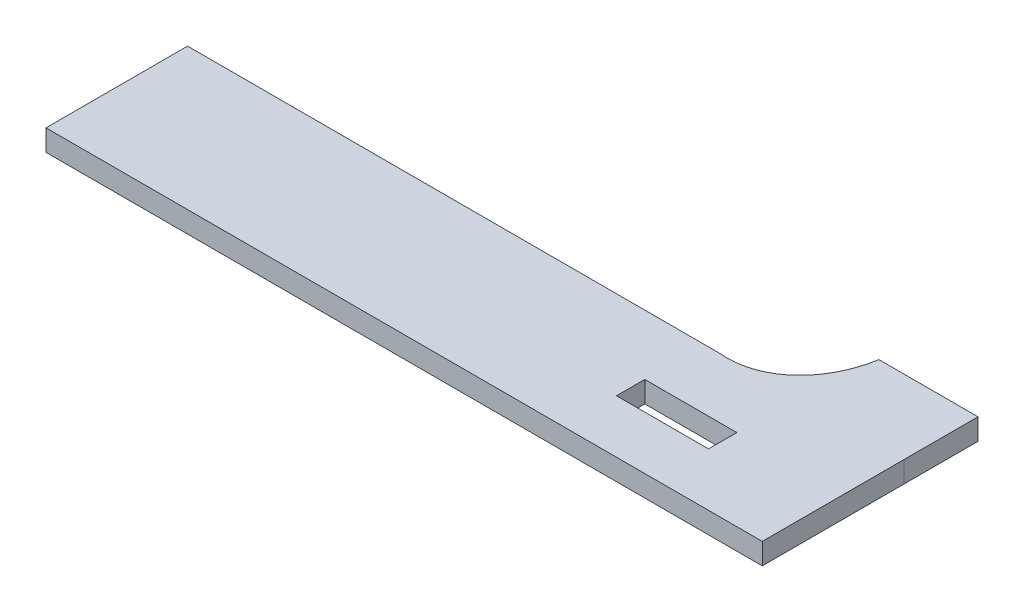
ISO-10303-21;
HEADER;
FILE_DESCRIPTION(('STEP AP214'),'2;1');
FILE_NAME('part.step','',(''),(''),'','','');
FILE_SCHEMA(('AUTOMOTIVE_DESIGN { 1 0 10303 214 1 1 1 1 }'));
ENDSEC;
DATA;
#1=APPLICATION_CONTEXT('core data for automotive mechanical design processes');
#2=APPLICATION_PROTOCOL_DEFINITION('international standard','automotive_design',2000,#1);
#3=PRODUCT_CONTEXT('',#1,'mechanical');
#4=PRODUCT('Part','Part','',(#3));
#5=PRODUCT_RELATED_PRODUCT_CATEGORY('part','',(#4));
#6=PRODUCT_DEFINITION_FORMATION('','',#4);
#7=PRODUCT_DEFINITION_CONTEXT('part definition',#1,'design');
#8=PRODUCT_DEFINITION('design','',#6,#7);
#9=PRODUCT_DEFINITION_SHAPE('','',#8);
#10=(LENGTH_UNIT() NAMED_UNIT(*) SI_UNIT(.MILLI.,.METRE.));
#11=(NAMED_UNIT(*) PLANE_ANGLE_UNIT() SI_UNIT($,.RADIAN.));
#12=(NAMED_UNIT(*) SI_UNIT($,.STERADIAN.) SOLID_ANGLE_UNIT());
#13=UNCERTAINTY_MEASURE_WITH_UNIT(LENGTH_MEASURE(1.E-05),#10,'distance_accuracy_value','');
#14=(GEOMETRIC_REPRESENTATION_CONTEXT(3) GLOBAL_UNCERTAINTY_ASSIGNED_CONTEXT((#13)) GLOBAL_UNIT_ASSIGNED_CONTEXT((#10,
#11,#12)) REPRESENTATION_CONTEXT('',''));
#15=CARTESIAN_POINT('',(0.,0.,0.));
#16=DIRECTION('',(0.,0.,1.));
#17=DIRECTION('',(1.,0.,0.));
#18=AXIS2_PLACEMENT_3D('',#15,#16,#17);
#19=CARTESIAN_POINT('',(17.7324804360068,3.,-10.3817710380302));
#20=CARTESIAN_POINT('',(24.7769965206093,3.,-9.69292673499625));
#21=CARTESIAN_POINT('',(29.0309133016131,3.,-15.202698523246));
#22=CARTESIAN_POINT('',(29.9211927748743,3.,-20.8623706429771));
#23=B_SPLINE_CURVE_WITH_KNOTS('',3,(#19,#20,#21,#22),.UNSPECIFIED.,.F.,.F.,(4,4),(0.,1.),.UNSPECIFIED.);
#24=DIRECTION('',(0.,-1.,0.));
#25=VECTOR('',#24,1.);
#26=SURFACE_OF_LINEAR_EXTRUSION('',#23,#25);
#27=CARTESIAN_POINT('',(17.7324804360068,0.,-10.3817710380302));
#28=CARTESIAN_POINT('',(24.7769965206093,0.,-9.69292673499625));
#29=CARTESIAN_POINT('',(29.0309133016131,0.,-15.202698523246));
#30=CARTESIAN_POINT('',(29.9211927748743,0.,-20.8623706429771));
#31=B_SPLINE_CURVE_WITH_KNOTS('',3,(#27,#28,#29,#30),.UNSPECIFIED.,.F.,.F.,(4,4),(0.,1.),.UNSPECIFIED.);
#32=CARTESIAN_POINT('',(17.7324804360068,0.,-10.3817710380302));
#33=VERTEX_POINT('',#32);
#34=CARTESIAN_POINT('',(29.9211927748743,0.,-20.8623706429771));
#35=VERTEX_POINT('',#34);
#36=EDGE_CURVE('E153',#33,#35,#31,.T.);
#37=ORIENTED_EDGE('',*,*,#36,.F.);
#38=DIRECTION('',(0.,-1.,0.));
#39=VECTOR('',#38,1.);
#40=CARTESIAN_POINT('',(17.7324804360068,3.,-10.3817710380302));
#41=LINE('',#40,#39);
#42=CARTESIAN_POINT('',(17.7324804360068,3.,-10.3817710380302));
#43=VERTEX_POINT('',#42);
#44=EDGE_CURVE('E11',#43,#33,#41,.T.);
#45=ORIENTED_EDGE('',*,*,#44,.F.);
#46=CARTESIAN_POINT('',(29.9211927748743,3.,-20.8623706429771));
#47=VERTEX_POINT('',#46);
#48=EDGE_CURVE('E156',#43,#47,#23,.T.);
#49=ORIENTED_EDGE('',*,*,#48,.T.);
#50=DIRECTION('',(0.,-1.,0.));
#51=VECTOR('',#50,1.);
#52=CARTESIAN_POINT('',(29.9211927748743,3.,-20.8623706429771));
#53=LINE('',#52,#51);
#54=EDGE_CURVE('E182',#47,#35,#53,.T.);
#55=ORIENTED_EDGE('',*,*,#54,.T.);
#56=EDGE_LOOP('',(#37,#45,#49,#55));
#57=FACE_BOUND('',#56,.T.);
#58=ADVANCED_FACE('F38',(#57),#26,.T.);
#59=CARTESIAN_POINT('',(0.,3.,-10.3817710380302));
#60=DIRECTION('',(0.,0.,-1.));
#61=DIRECTION('',(-1.,0.,0.));
#62=AXIS2_PLACEMENT_3D('',#59,#60,#61);
#63=PLANE('',#62);
#64=DIRECTION('',(1.,0.,0.));
#65=VECTOR('',#64,1.);
#66=CARTESIAN_POINT('',(0.,0.,-10.3817710380302));
#67=LINE('',#66,#65);
#68=CARTESIAN_POINT('',(-57.2675195639932,0.,-10.3817710380302));
#69=VERTEX_POINT('',#68);
#70=EDGE_CURVE('E187',#69,#33,#67,.T.);
#71=ORIENTED_EDGE('',*,*,#70,.F.);
#72=DIRECTION('',(0.,-1.,0.));
#73=VECTOR('',#72,1.);
#74=CARTESIAN_POINT('',(-57.2675195639932,3.,-10.3817710380302));
#75=LINE('',#74,#73);
#76=CARTESIAN_POINT('',(-57.2675195639932,3.,-10.3817710380302));
#77=VERTEX_POINT('',#76);
#78=EDGE_CURVE('E46',#77,#69,#75,.T.);
#79=ORIENTED_EDGE('',*,*,#78,.F.);
#80=DIRECTION('',(1.,0.,0.));
#81=VECTOR('',#80,1.);
#82=CARTESIAN_POINT('',(0.,3.,-10.3817710380302));
#83=LINE('',#82,#81);
#84=EDGE_CURVE('E162',#77,#43,#83,.T.);
#85=ORIENTED_EDGE('',*,*,#84,.T.);
#86=ORIENTED_EDGE('',*,*,#44,.T.);
#87=EDGE_LOOP('',(#71,#79,#85,#86));
#88=FACE_BOUND('',#87,.T.);
#89=ADVANCED_FACE('F224',(#88),#63,.T.);
#90=CARTESIAN_POINT('',(-57.2675195639932,3.,0.));
#91=DIRECTION('',(1.,0.,0.));
#92=DIRECTION('',(0.,0.,-1.));
#93=AXIS2_PLACEMENT_3D('',#90,#91,#92);
#94=PLANE('',#93);
#95=DIRECTION('',(0.,0.,1.));
#96=VECTOR('',#95,1.);
#97=CARTESIAN_POINT('',(-57.2675195639932,0.,0.));
#98=LINE('',#97,#96);
#99=CARTESIAN_POINT('',(-57.2675195639932,0.,9.61822896196981));
#100=VERTEX_POINT('',#99);
#101=EDGE_CURVE('E193',#69,#100,#98,.T.);
#102=ORIENTED_EDGE('',*,*,#101,.T.);
#103=DIRECTION('',(0.,-1.,0.));
#104=VECTOR('',#103,1.);
#105=CARTESIAN_POINT('',(-57.2675195639932,3.,9.61822896196981));
#106=LINE('',#105,#104);
#107=CARTESIAN_POINT('',(-57.2675195639932,3.,9.61822896196981));
#108=VERTEX_POINT('',#107);
#109=EDGE_CURVE('E213',#108,#100,#106,.T.);
#110=ORIENTED_EDGE('',*,*,#109,.F.);
#111=DIRECTION('',(0.,0.,1.));
#112=VECTOR('',#111,1.);
#113=CARTESIAN_POINT('',(-57.2675195639932,3.,0.));
#114=LINE('',#113,#112);
#115=EDGE_CURVE('E169',#77,#108,#114,.T.);
#116=ORIENTED_EDGE('',*,*,#115,.F.);
#117=ORIENTED_EDGE('',*,*,#78,.T.);
#118=EDGE_LOOP('',(#102,#110,#116,#117));
#119=FACE_BOUND('',#118,.T.);
#120=ADVANCED_FACE('F218',(#119),#94,.F.);
#121=CARTESIAN_POINT('',(0.,3.,9.61822896196981));
#122=DIRECTION('',(0.,0.,-1.));
#123=DIRECTION('',(-1.,0.,0.));
#124=AXIS2_PLACEMENT_3D('',#121,#122,#123);
#125=PLANE('',#124);
#126=DIRECTION('',(1.,0.,0.));
#127=VECTOR('',#126,1.);
#128=CARTESIAN_POINT('',(0.,0.,9.61822896196981));
#129=LINE('',#128,#127);
#130=CARTESIAN_POINT('',(43.9224804360068,0.,9.61822896196981));
#131=VERTEX_POINT('',#130);
#132=EDGE_CURVE('E195',#100,#131,#129,.T.);
#133=ORIENTED_EDGE('',*,*,#132,.T.);
#134=DIRECTION('',(0.,-1.,0.));
#135=VECTOR('',#134,1.);
#136=CARTESIAN_POINT('',(43.9224804360068,3.,9.61822896196981));
#137=LINE('',#136,#135);
#138=CARTESIAN_POINT('',(43.9224804360068,3.,9.61822896196981));
#139=VERTEX_POINT('',#138);
#140=EDGE_CURVE('E211',#139,#131,#137,.T.);
#141=ORIENTED_EDGE('',*,*,#140,.F.);
#142=DIRECTION('',(1.,0.,0.));
#143=VECTOR('',#142,1.);
#144=CARTESIAN_POINT('',(0.,3.,9.61822896196981));
#145=LINE('',#144,#143);
#146=EDGE_CURVE('E171',#108,#139,#145,.T.);
#147=ORIENTED_EDGE('',*,*,#146,.F.);
#148=ORIENTED_EDGE('',*,*,#109,.T.);
#149=EDGE_LOOP('',(#133,#141,#147,#148));
#150=FACE_BOUND('',#149,.T.);
#151=ADVANCED_FACE('F243',(#150),#125,.F.);
#152=CARTESIAN_POINT('',(43.9224804360068,3.,0.));
#153=DIRECTION('',(1.,0.,0.));
#154=DIRECTION('',(0.,0.,-1.));
#155=AXIS2_PLACEMENT_3D('',#152,#153,#154);
#156=PLANE('',#155);
#157=DIRECTION('',(0.,0.,1.));
#158=VECTOR('',#157,1.);
#159=CARTESIAN_POINT('',(43.9224804360068,0.,0.));
#160=LINE('',#159,#158);
#161=CARTESIAN_POINT('',(43.9224804360068,0.,-10.3817710380302));
#162=VERTEX_POINT('',#161);
#163=EDGE_CURVE('E198',#162,#131,#160,.T.);
#164=ORIENTED_EDGE('',*,*,#163,.F.);
#165=DIRECTION('',(0.,-1.,0.));
#166=VECTOR('',#165,1.);
#167=CARTESIAN_POINT('',(43.9224804360068,3.,-10.3817710380302));
#168=LINE('',#167,#166);
#169=CARTESIAN_POINT('',(43.9224804360068,3.,-10.3817710380302));
#170=VERTEX_POINT('',#169);
#171=EDGE_CURVE('E209',#170,#162,#168,.T.);
#172=ORIENTED_EDGE('',*,*,#171,.F.);
#173=DIRECTION('',(0.,0.,1.));
#174=VECTOR('',#173,1.);
#175=CARTESIAN_POINT('',(43.9224804360068,3.,0.));
#176=LINE('',#175,#174);
#177=EDGE_CURVE('E173',#170,#139,#176,.T.);
#178=ORIENTED_EDGE('',*,*,#177,.T.);
#179=ORIENTED_EDGE('',*,*,#140,.T.);
#180=EDGE_LOOP('',(#164,#172,#178,#179));
#181=FACE_BOUND('',#180,.T.);
#182=ADVANCED_FACE('F238',(#181),#156,.T.);
#183=CARTESIAN_POINT('',(43.9237552918976,3.,-0.00539653403582726));
#184=DIRECTION('',(0.999999992452538,0.,-0.00012286139833068));
#185=DIRECTION('',(-0.00012286139833068,0.,-0.999999992452538));
#186=AXIS2_PLACEMENT_3D('',#183,#184,#185);
#187=PLANE('',#186);
#188=DIRECTION('',(0.00012286139833068,0.,0.999999992452538));
#189=VECTOR('',#188,1.);
#190=CARTESIAN_POINT('',(43.9237552918976,0.,-0.00539653403582726));
#191=LINE('',#190,#189);
#192=CARTESIAN_POINT('',(43.9211927748743,0.,-20.8623706429771));
#193=VERTEX_POINT('',#192);
#194=EDGE_CURVE('E201',#193,#162,#191,.T.);
#195=ORIENTED_EDGE('',*,*,#194,.F.);
#196=DIRECTION('',(0.,-1.,0.));
#197=VECTOR('',#196,1.);
#198=CARTESIAN_POINT('',(43.9211927748743,3.,-20.8623706429771));
#199=LINE('',#198,#197);
#200=CARTESIAN_POINT('',(43.9211927748743,3.,-20.8623706429771));
#201=VERTEX_POINT('',#200);
#202=EDGE_CURVE('E207',#201,#193,#199,.T.);
#203=ORIENTED_EDGE('',*,*,#202,.F.);
#204=DIRECTION('',(0.00012286139833068,0.,0.999999992452538));
#205=VECTOR('',#204,1.);
#206=CARTESIAN_POINT('',(43.9237552918976,3.,-0.00539653403582726));
#207=LINE('',#206,#205);
#208=EDGE_CURVE('E176',#201,#170,#207,.T.);
#209=ORIENTED_EDGE('',*,*,#208,.T.);
#210=ORIENTED_EDGE('',*,*,#171,.T.);
#211=EDGE_LOOP('',(#195,#203,#209,#210));
#212=FACE_BOUND('',#211,.T.);
#213=ADVANCED_FACE('F235',(#212),#187,.T.);
#214=CARTESIAN_POINT('',(0.,3.,-20.8623706429771));
#215=DIRECTION('',(0.,0.,-1.));
#216=DIRECTION('',(-1.,0.,0.));
#217=AXIS2_PLACEMENT_3D('',#214,#215,#216);
#218=PLANE('',#217);
#219=DIRECTION('',(1.,0.,0.));
#220=VECTOR('',#219,1.);
#221=CARTESIAN_POINT('',(0.,0.,-20.8623706429771));
#222=LINE('',#221,#220);
#223=EDGE_CURVE('E163',#35,#193,#222,.T.);
#224=ORIENTED_EDGE('',*,*,#223,.F.);
#225=ORIENTED_EDGE('',*,*,#54,.F.);
#226=DIRECTION('',(1.,0.,0.));
#227=VECTOR('',#226,1.);
#228=CARTESIAN_POINT('',(0.,3.,-20.8623706429771));
#229=LINE('',#228,#227);
#230=EDGE_CURVE('E179',#47,#201,#229,.T.);
#231=ORIENTED_EDGE('',*,*,#230,.T.);
#232=ORIENTED_EDGE('',*,*,#202,.T.);
#233=EDGE_LOOP('',(#224,#225,#231,#232));
#234=FACE_BOUND('',#233,.T.);
#235=ADVANCED_FACE('F230',(#234),#218,.T.);
#236=CARTESIAN_POINT('',(0.,3.,0.));
#237=DIRECTION('',(0.,1.,0.));
#238=DIRECTION('',(0.,0.,1.));
#239=AXIS2_PLACEMENT_3D('',#236,#237,#238);
#240=PLANE('',#239);
#241=DIRECTION('',(0.,0.,1.));
#242=VECTOR('',#241,1.);
#243=CARTESIAN_POINT('',(15.8126019458903,3.,-1.89903766646022));
#244=LINE('',#243,#242);
#245=CARTESIAN_POINT('',(15.8126019458903,3.,-1.89903766646022));
#246=VERTEX_POINT('',#245);
#247=CARTESIAN_POINT('',(15.8126019458903,3.,2.10096233353978));
#248=VERTEX_POINT('',#247);
#249=EDGE_CURVE('E53',#246,#248,#244,.T.);
#250=ORIENTED_EDGE('',*,*,#249,.F.);
#251=DIRECTION('',(-1.,0.,0.));
#252=VECTOR('',#251,1.);
#253=CARTESIAN_POINT('',(15.8126019458903,3.,-1.89903766646022));
#254=LINE('',#253,#252);
#255=CARTESIAN_POINT('',(28.8126019458903,3.,-1.89903766646022));
#256=VERTEX_POINT('',#255);
#257=EDGE_CURVE('E138',#256,#246,#254,.T.);
#258=ORIENTED_EDGE('',*,*,#257,.F.);
#259=DIRECTION('',(0.,0.,-1.));
#260=VECTOR('',#259,1.);
#261=CARTESIAN_POINT('',(28.8126019458903,3.,-1.89903766646022));
#262=LINE('',#261,#260);
#263=CARTESIAN_POINT('',(28.8126019458903,3.,2.10096233353978));
#264=VERTEX_POINT('',#263);
#265=EDGE_CURVE('E141',#264,#256,#262,.T.);
#266=ORIENTED_EDGE('',*,*,#265,.F.);
#267=DIRECTION('',(1.,0.,0.));
#268=VECTOR('',#267,1.);
#269=CARTESIAN_POINT('',(15.8126019458903,3.,2.10096233353978));
#270=LINE('',#269,#268);
#271=EDGE_CURVE('E147',#248,#264,#270,.T.);
#272=ORIENTED_EDGE('',*,*,#271,.F.);
#273=EDGE_LOOP('',(#250,#258,#266,#272));
#274=FACE_BOUND('',#273,.T.);
#275=ORIENTED_EDGE('',*,*,#48,.F.);
#276=ORIENTED_EDGE('',*,*,#84,.F.);
#277=ORIENTED_EDGE('',*,*,#115,.T.);
#278=ORIENTED_EDGE('',*,*,#146,.T.);
#279=ORIENTED_EDGE('',*,*,#177,.F.);
#280=ORIENTED_EDGE('',*,*,#208,.F.);
#281=ORIENTED_EDGE('',*,*,#230,.F.);
#282=EDGE_LOOP('',(#275,#276,#277,#278,#279,#280,#281));
#283=FACE_BOUND('',#282,.T.);
#284=ADVANCED_FACE('F245',(#274,#283),#240,.T.);
#285=CARTESIAN_POINT('',(0.,0.,0.));
#286=DIRECTION('',(0.,1.,0.));
#287=DIRECTION('',(0.,0.,1.));
#288=AXIS2_PLACEMENT_3D('',#285,#286,#287);
#289=PLANE('',#288);
#290=DIRECTION('',(-1.,0.,0.));
#291=VECTOR('',#290,1.);
#292=CARTESIAN_POINT('',(15.8126019458903,0.,-1.89903766646022));
#293=LINE('',#292,#291);
#294=CARTESIAN_POINT('',(28.8126019458903,0.,-1.89903766646022));
#295=VERTEX_POINT('',#294);
#296=CARTESIAN_POINT('',(15.8126019458903,0.,-1.89903766646022));
#297=VERTEX_POINT('',#296);
#298=EDGE_CURVE('E128',#295,#297,#293,.T.);
#299=ORIENTED_EDGE('',*,*,#298,.T.);
#300=DIRECTION('',(0.,0.,1.));
#301=VECTOR('',#300,1.);
#302=CARTESIAN_POINT('',(15.8126019458903,0.,-1.89903766646022));
#303=LINE('',#302,#301);
#304=CARTESIAN_POINT('',(15.8126019458903,0.,2.10096233353978));
#305=VERTEX_POINT('',#304);
#306=EDGE_CURVE('E122',#297,#305,#303,.T.);
#307=ORIENTED_EDGE('',*,*,#306,.T.);
#308=DIRECTION('',(1.,0.,0.));
#309=VECTOR('',#308,1.);
#310=CARTESIAN_POINT('',(15.8126019458903,0.,2.10096233353978));
#311=LINE('',#310,#309);
#312=CARTESIAN_POINT('',(28.8126019458903,0.,2.10096233353978));
#313=VERTEX_POINT('',#312);
#314=EDGE_CURVE('E131',#305,#313,#311,.T.);
#315=ORIENTED_EDGE('',*,*,#314,.T.);
#316=DIRECTION('',(0.,0.,-1.));
#317=VECTOR('',#316,1.);
#318=CARTESIAN_POINT('',(28.8126019458903,0.,-1.89903766646022));
#319=LINE('',#318,#317);
#320=EDGE_CURVE('E61',#313,#295,#319,.T.);
#321=ORIENTED_EDGE('',*,*,#320,.T.);
#322=EDGE_LOOP('',(#299,#307,#315,#321));
#323=FACE_BOUND('',#322,.T.);
#324=ORIENTED_EDGE('',*,*,#36,.T.);
#325=ORIENTED_EDGE('',*,*,#223,.T.);
#326=ORIENTED_EDGE('',*,*,#194,.T.);
#327=ORIENTED_EDGE('',*,*,#163,.T.);
#328=ORIENTED_EDGE('',*,*,#132,.F.);
#329=ORIENTED_EDGE('',*,*,#101,.F.);
#330=ORIENTED_EDGE('',*,*,#70,.T.);
#331=EDGE_LOOP('',(#324,#325,#326,#327,#328,#329,#330));
#332=FACE_BOUND('',#331,.T.);
#333=ADVANCED_FACE('F135',(#323,#332),#289,.F.);
#334=CARTESIAN_POINT('',(15.8126019458903,0.,-1.89903766646022));
#335=DIRECTION('',(-1.,0.,0.));
#336=DIRECTION('',(0.,0.,1.));
#337=AXIS2_PLACEMENT_3D('',#334,#335,#336);
#338=PLANE('',#337);
#339=ORIENTED_EDGE('',*,*,#249,.T.);
#340=DIRECTION('',(0.,1.,0.));
#341=VECTOR('',#340,1.);
#342=CARTESIAN_POINT('',(15.8126019458903,0.,2.10096233353978));
#343=LINE('',#342,#341);
#344=EDGE_CURVE('E118',#305,#248,#343,.T.);
#345=ORIENTED_EDGE('',*,*,#344,.F.);
#346=ORIENTED_EDGE('',*,*,#306,.F.);
#347=DIRECTION('',(0.,1.,0.));
#348=VECTOR('',#347,1.);
#349=CARTESIAN_POINT('',(15.8126019458903,0.,-1.89903766646022));
#350=LINE('',#349,#348);
#351=EDGE_CURVE('E151',#297,#246,#350,.T.);
#352=ORIENTED_EDGE('',*,*,#351,.T.);
#353=EDGE_LOOP('',(#339,#345,#346,#352));
#354=FACE_BOUND('',#353,.T.);
#355=ADVANCED_FACE('F120',(#354),#338,.F.);
#356=CARTESIAN_POINT('',(15.8126019458903,0.,-1.89903766646022));
#357=DIRECTION('',(0.,0.,-1.));
#358=DIRECTION('',(-1.,0.,0.));
#359=AXIS2_PLACEMENT_3D('',#356,#357,#358);
#360=PLANE('',#359);
#361=ORIENTED_EDGE('',*,*,#257,.T.);
#362=ORIENTED_EDGE('',*,*,#351,.F.);
#363=ORIENTED_EDGE('',*,*,#298,.F.);
#364=DIRECTION('',(0.,1.,0.));
#365=VECTOR('',#364,1.);
#366=CARTESIAN_POINT('',(28.8126019458903,0.,-1.89903766646022));
#367=LINE('',#366,#365);
#368=EDGE_CURVE('E154',#295,#256,#367,.T.);
#369=ORIENTED_EDGE('',*,*,#368,.T.);
#370=EDGE_LOOP('',(#361,#362,#363,#369));
#371=FACE_BOUND('',#370,.T.);
#372=ADVANCED_FACE('F300',(#371),#360,.F.);
#373=CARTESIAN_POINT('',(28.8126019458903,0.,-1.89903766646022));
#374=DIRECTION('',(1.,0.,0.));
#375=DIRECTION('',(0.,0.,-1.));
#376=AXIS2_PLACEMENT_3D('',#373,#374,#375);
#377=PLANE('',#376);
#378=ORIENTED_EDGE('',*,*,#265,.T.);
#379=ORIENTED_EDGE('',*,*,#368,.F.);
#380=ORIENTED_EDGE('',*,*,#320,.F.);
#381=DIRECTION('',(0.,1.,0.));
#382=VECTOR('',#381,1.);
#383=CARTESIAN_POINT('',(28.8126019458903,0.,2.10096233353978));
#384=LINE('',#383,#382);
#385=EDGE_CURVE('E127',#313,#264,#384,.T.);
#386=ORIENTED_EDGE('',*,*,#385,.T.);
#387=EDGE_LOOP('',(#378,#379,#380,#386));
#388=FACE_BOUND('',#387,.T.);
#389=ADVANCED_FACE('F309',(#388),#377,.F.);
#390=CARTESIAN_POINT('',(15.8126019458903,0.,2.10096233353978));
#391=DIRECTION('',(0.,0.,1.));
#392=DIRECTION('',(1.,0.,0.));
#393=AXIS2_PLACEMENT_3D('',#390,#391,#392);
#394=PLANE('',#393);
#395=ORIENTED_EDGE('',*,*,#271,.T.);
#396=ORIENTED_EDGE('',*,*,#385,.F.);
#397=ORIENTED_EDGE('',*,*,#314,.F.);
#398=ORIENTED_EDGE('',*,*,#344,.T.);
#399=EDGE_LOOP('',(#395,#396,#397,#398));
#400=FACE_BOUND('',#399,.T.);
#401=ADVANCED_FACE('F132',(#400),#394,.F.);
#402=CLOSED_SHELL('',(#58,#89,#120,#151,#182,#213,#235,#284,#333,#355,#372,#389,#401));
#403=MANIFOLD_SOLID_BREP('B2',#402);
#404=ADVANCED_BREP_SHAPE_REPRESENTATION('',(#18,#403),#14);
#405=SHAPE_DEFINITION_REPRESENTATION(#9,#404);
ENDSEC;
END-ISO-10303-21;
